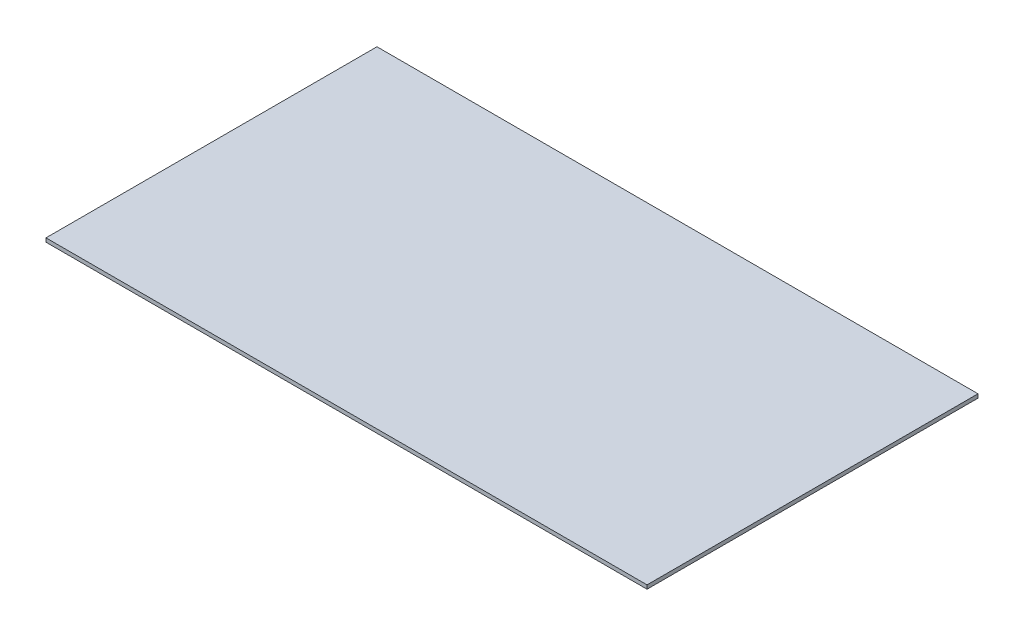
ISO-10303-21;
HEADER;
FILE_DESCRIPTION(('STEP AP214'),'2;1');
FILE_NAME('part.step','',(''),(''),'','','');
FILE_SCHEMA(('AUTOMOTIVE_DESIGN { 1 0 10303 214 1 1 1 1 }'));
ENDSEC;
DATA;
#1=APPLICATION_CONTEXT('core data for automotive mechanical design processes');
#2=APPLICATION_PROTOCOL_DEFINITION('international standard','automotive_design',2000,#1);
#3=PRODUCT_CONTEXT('',#1,'mechanical');
#4=PRODUCT('Part','Part','',(#3));
#5=PRODUCT_RELATED_PRODUCT_CATEGORY('part','',(#4));
#6=PRODUCT_DEFINITION_FORMATION('','',#4);
#7=PRODUCT_DEFINITION_CONTEXT('part definition',#1,'design');
#8=PRODUCT_DEFINITION('design','',#6,#7);
#9=PRODUCT_DEFINITION_SHAPE('','',#8);
#10=(LENGTH_UNIT() NAMED_UNIT(*) SI_UNIT(.MILLI.,.METRE.));
#11=(NAMED_UNIT(*) PLANE_ANGLE_UNIT() SI_UNIT($,.RADIAN.));
#12=(NAMED_UNIT(*) SI_UNIT($,.STERADIAN.) SOLID_ANGLE_UNIT());
#13=UNCERTAINTY_MEASURE_WITH_UNIT(LENGTH_MEASURE(1.E-05),#10,'distance_accuracy_value','');
#14=(GEOMETRIC_REPRESENTATION_CONTEXT(3) GLOBAL_UNCERTAINTY_ASSIGNED_CONTEXT((#13)) GLOBAL_UNIT_ASSIGNED_CONTEXT((#10,
#11,#12)) REPRESENTATION_CONTEXT('',''));
#15=CARTESIAN_POINT('',(0.,0.,0.));
#16=DIRECTION('',(0.,0.,1.));
#17=DIRECTION('',(1.,0.,0.));
#18=AXIS2_PLACEMENT_3D('',#15,#16,#17);
#19=CARTESIAN_POINT('',(0.,40.,-2450.03164525274));
#20=DIRECTION('',(1.,0.,0.));
#21=DIRECTION('',(0.,0.,-1.));
#22=AXIS2_PLACEMENT_3D('',#19,#20,#21);
#23=PLANE('',#22);
#24=DIRECTION('',(0.,-1.,0.));
#25=VECTOR('',#24,1.);
#26=CARTESIAN_POINT('',(0.,40.,-870.000000000024));
#27=LINE('',#26,#25);
#28=CARTESIAN_POINT('',(0.,50.,-870.000000000024));
#29=VERTEX_POINT('',#28);
#30=CARTESIAN_POINT('',(0.,40.,-870.000000000024));
#31=VERTEX_POINT('',#30);
#32=EDGE_CURVE('E47',#29,#31,#27,.T.);
#33=ORIENTED_EDGE('',*,*,#32,.F.);
#34=DIRECTION('',(0.,0.,1.));
#35=VECTOR('',#34,1.);
#36=CARTESIAN_POINT('',(0.,50.,-2450.03164525274));
#37=LINE('',#36,#35);
#38=CARTESIAN_POINT('',(0.,50.,0.));
#39=VERTEX_POINT('',#38);
#40=EDGE_CURVE('E75',#29,#39,#37,.T.);
#41=ORIENTED_EDGE('',*,*,#40,.T.);
#42=DIRECTION('',(0.,1.,0.));
#43=VECTOR('',#42,1.);
#44=CARTESIAN_POINT('',(0.,40.,0.));
#45=LINE('',#44,#43);
#46=CARTESIAN_POINT('',(0.,40.,0.));
#47=VERTEX_POINT('',#46);
#48=EDGE_CURVE('E79',#47,#39,#45,.T.);
#49=ORIENTED_EDGE('',*,*,#48,.F.);
#50=DIRECTION('',(0.,0.,1.));
#51=VECTOR('',#50,1.);
#52=CARTESIAN_POINT('',(0.,40.,-2450.03164525274));
#53=LINE('',#52,#51);
#54=EDGE_CURVE('E108',#31,#47,#53,.T.);
#55=ORIENTED_EDGE('',*,*,#54,.F.);
#56=EDGE_LOOP('',(#33,#41,#49,#55));
#57=FACE_BOUND('',#56,.T.);
#58=ADVANCED_FACE('F38',(#57),#23,.T.);
#59=CARTESIAN_POINT('',(0.,40.,-2450.03164525274));
#60=DIRECTION('',(0.,-1.,0.));
#61=DIRECTION('',(1.,0.,0.));
#62=AXIS2_PLACEMENT_3D('',#59,#60,#61);
#63=PLANE('',#62);
#64=DIRECTION('',(-1.,0.,0.));
#65=VECTOR('',#64,1.);
#66=CARTESIAN_POINT('',(0.,40.,-870.000000000024));
#67=LINE('',#66,#65);
#68=CARTESIAN_POINT('',(-1580.,39.9999999999998,-870.000000000024));
#69=VERTEX_POINT('',#68);
#70=EDGE_CURVE('E53',#31,#69,#67,.T.);
#71=ORIENTED_EDGE('',*,*,#70,.F.);
#72=ORIENTED_EDGE('',*,*,#54,.T.);
#73=DIRECTION('',(1.,0.,0.));
#74=VECTOR('',#73,1.);
#75=CARTESIAN_POINT('',(0.,40.,0.));
#76=LINE('',#75,#74);
#77=CARTESIAN_POINT('',(-1580.,39.9999999999998,0.));
#78=VERTEX_POINT('',#77);
#79=EDGE_CURVE('E85',#78,#47,#76,.T.);
#80=ORIENTED_EDGE('',*,*,#79,.F.);
#81=DIRECTION('',(0.,0.,1.));
#82=VECTOR('',#81,1.);
#83=CARTESIAN_POINT('',(-1580.,39.9999999999998,-2450.03164525274));
#84=LINE('',#83,#82);
#85=EDGE_CURVE('E112',#69,#78,#84,.T.);
#86=ORIENTED_EDGE('',*,*,#85,.F.);
#87=EDGE_LOOP('',(#71,#72,#80,#86));
#88=FACE_BOUND('',#87,.T.);
#89=ADVANCED_FACE('F134',(#88),#63,.T.);
#90=CARTESIAN_POINT('',(-1580.,39.9999999999998,-2450.03164525274));
#91=DIRECTION('',(-1.,0.,0.));
#92=DIRECTION('',(0.,0.,1.));
#93=AXIS2_PLACEMENT_3D('',#90,#91,#92);
#94=PLANE('',#93);
#95=DIRECTION('',(0.,1.,0.));
#96=VECTOR('',#95,1.);
#97=CARTESIAN_POINT('',(-1580.,39.9999999999998,-870.000000000024));
#98=LINE('',#97,#96);
#99=CARTESIAN_POINT('',(-1580.,49.9999999999998,-870.000000000024));
#100=VERTEX_POINT('',#99);
#101=EDGE_CURVE('E111',#69,#100,#98,.T.);
#102=ORIENTED_EDGE('',*,*,#101,.F.);
#103=ORIENTED_EDGE('',*,*,#85,.T.);
#104=DIRECTION('',(0.,-1.,0.));
#105=VECTOR('',#104,1.);
#106=CARTESIAN_POINT('',(-1580.,39.9999999999998,0.));
#107=LINE('',#106,#105);
#108=CARTESIAN_POINT('',(-1580.,49.9999999999998,0.));
#109=VERTEX_POINT('',#108);
#110=EDGE_CURVE('E94',#109,#78,#107,.T.);
#111=ORIENTED_EDGE('',*,*,#110,.F.);
#112=DIRECTION('',(0.,0.,1.));
#113=VECTOR('',#112,1.);
#114=CARTESIAN_POINT('',(-1580.,49.9999999999998,-2450.03164525274));
#115=LINE('',#114,#113);
#116=EDGE_CURVE('E84',#100,#109,#115,.T.);
#117=ORIENTED_EDGE('',*,*,#116,.F.);
#118=EDGE_LOOP('',(#102,#103,#111,#117));
#119=FACE_BOUND('',#118,.T.);
#120=ADVANCED_FACE('F136',(#119),#94,.T.);
#121=CARTESIAN_POINT('',(0.,50.,-2450.03164525274));
#122=DIRECTION('',(0.,1.,0.));
#123=DIRECTION('',(-1.,0.,0.));
#124=AXIS2_PLACEMENT_3D('',#121,#122,#123);
#125=PLANE('',#124);
#126=DIRECTION('',(1.,0.,0.));
#127=VECTOR('',#126,1.);
#128=CARTESIAN_POINT('',(0.,50.,-870.000000000024));
#129=LINE('',#128,#127);
#130=EDGE_CURVE('E11',#100,#29,#129,.T.);
#131=ORIENTED_EDGE('',*,*,#130,.F.);
#132=ORIENTED_EDGE('',*,*,#116,.T.);
#133=DIRECTION('',(-1.,0.,0.));
#134=VECTOR('',#133,1.);
#135=CARTESIAN_POINT('',(0.,50.,0.));
#136=LINE('',#135,#134);
#137=EDGE_CURVE('E87',#39,#109,#136,.T.);
#138=ORIENTED_EDGE('',*,*,#137,.F.);
#139=ORIENTED_EDGE('',*,*,#40,.F.);
#140=EDGE_LOOP('',(#131,#132,#138,#139));
#141=FACE_BOUND('',#140,.T.);
#142=ADVANCED_FACE('F88',(#141),#125,.T.);
#143=CARTESIAN_POINT('',(0.,0.,0.));
#144=DIRECTION('',(0.,0.,1.));
#145=DIRECTION('',(1.,0.,0.));
#146=AXIS2_PLACEMENT_3D('',#143,#144,#145);
#147=PLANE('',#146);
#148=ORIENTED_EDGE('',*,*,#48,.T.);
#149=ORIENTED_EDGE('',*,*,#137,.T.);
#150=ORIENTED_EDGE('',*,*,#110,.T.);
#151=ORIENTED_EDGE('',*,*,#79,.T.);
#152=EDGE_LOOP('',(#148,#149,#150,#151));
#153=FACE_BOUND('',#152,.T.);
#154=ADVANCED_FACE('F96',(#153),#147,.T.);
#155=CARTESIAN_POINT('',(-1603.56728673063,0.,-870.000000000024));
#156=DIRECTION('',(0.,0.,1.));
#157=DIRECTION('',(1.,0.,0.));
#158=AXIS2_PLACEMENT_3D('',#155,#156,#157);
#159=PLANE('',#158);
#160=ORIENTED_EDGE('',*,*,#32,.T.);
#161=ORIENTED_EDGE('',*,*,#70,.T.);
#162=ORIENTED_EDGE('',*,*,#101,.T.);
#163=ORIENTED_EDGE('',*,*,#130,.T.);
#164=EDGE_LOOP('',(#160,#161,#162,#163));
#165=FACE_BOUND('',#164,.T.);
#166=ADVANCED_FACE('F131',(#165),#159,.F.);
#167=CLOSED_SHELL('',(#58,#89,#120,#142,#154,#166));
#168=MANIFOLD_SOLID_BREP('B2',#167);
#169=ADVANCED_BREP_SHAPE_REPRESENTATION('',(#18,#168),#14);
#170=SHAPE_DEFINITION_REPRESENTATION(#9,#169);
ENDSEC;
END-ISO-10303-21;
